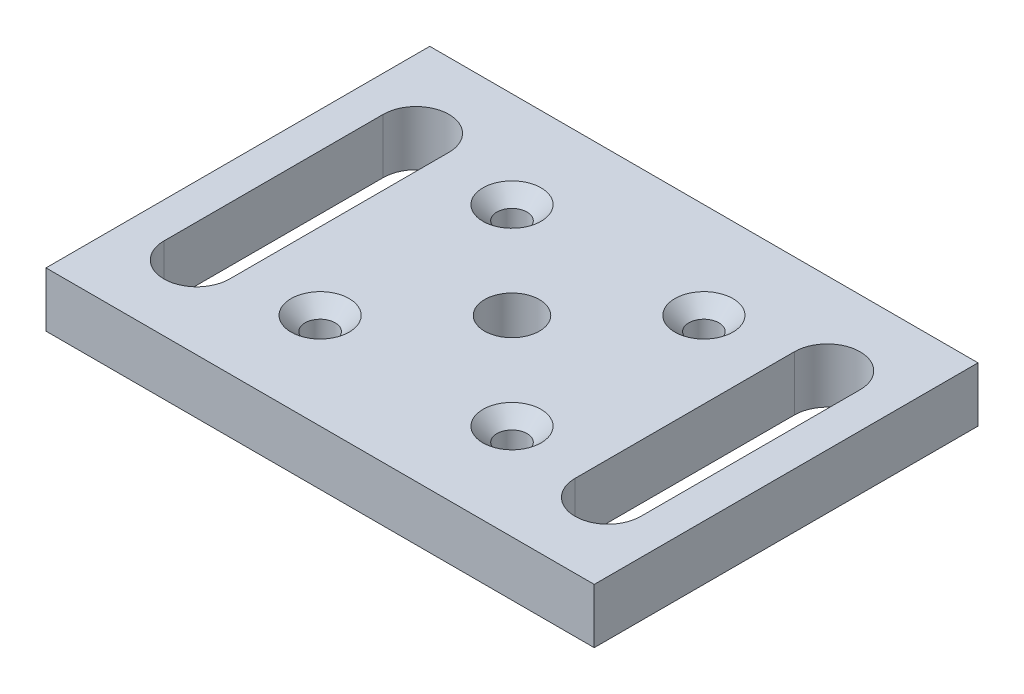
ISO-10303-21;
HEADER;
FILE_DESCRIPTION(('STEP AP214'),'2;1');
FILE_NAME('part.step','',(''),(''),'','','');
FILE_SCHEMA(('AUTOMOTIVE_DESIGN { 1 0 10303 214 1 1 1 1 }'));
ENDSEC;
DATA;
#1=APPLICATION_CONTEXT('core data for automotive mechanical design processes');
#2=APPLICATION_PROTOCOL_DEFINITION('international standard','automotive_design',2000,#1);
#3=PRODUCT_CONTEXT('',#1,'mechanical');
#4=PRODUCT('Part','Part','',(#3));
#5=PRODUCT_RELATED_PRODUCT_CATEGORY('part','',(#4));
#6=PRODUCT_DEFINITION_FORMATION('','',#4);
#7=PRODUCT_DEFINITION_CONTEXT('part definition',#1,'design');
#8=PRODUCT_DEFINITION('design','',#6,#7);
#9=PRODUCT_DEFINITION_SHAPE('','',#8);
#10=(LENGTH_UNIT() NAMED_UNIT(*) SI_UNIT(.MILLI.,.METRE.));
#11=(NAMED_UNIT(*) PLANE_ANGLE_UNIT() SI_UNIT($,.RADIAN.));
#12=(NAMED_UNIT(*) SI_UNIT($,.STERADIAN.) SOLID_ANGLE_UNIT());
#13=UNCERTAINTY_MEASURE_WITH_UNIT(LENGTH_MEASURE(1.E-05),#10,'distance_accuracy_value','');
#14=(GEOMETRIC_REPRESENTATION_CONTEXT(3) GLOBAL_UNCERTAINTY_ASSIGNED_CONTEXT((#13)) GLOBAL_UNIT_ASSIGNED_CONTEXT((#10,
#11,#12)) REPRESENTATION_CONTEXT('',''));
#15=CARTESIAN_POINT('',(0.,0.,0.));
#16=DIRECTION('',(0.,0.,1.));
#17=DIRECTION('',(1.,0.,0.));
#18=AXIS2_PLACEMENT_3D('',#15,#16,#17);
#19=CARTESIAN_POINT('',(0.,0.,0.));
#20=DIRECTION('',(0.,-1.,0.));
#21=DIRECTION('',(0.,0.,-1.));
#22=AXIS2_PLACEMENT_3D('',#19,#20,#21);
#23=PLANE('',#22);
#24=CARTESIAN_POINT('',(32.5,0.,-52.5));
#25=DIRECTION('',(0.,1.,0.));
#26=DIRECTION('',(0.,0.,1.));
#27=AXIS2_PLACEMENT_3D('',#24,#25,#26);
#28=CIRCLE('',#27,2.75);
#29=CARTESIAN_POINT('',(32.5,0.,-49.75));
#30=VERTEX_POINT('',#29);
#31=EDGE_CURVE('E339',#30,#30,#28,.T.);
#32=ORIENTED_EDGE('',*,*,#31,.T.);
#33=EDGE_LOOP('',(#32));
#34=FACE_BOUND('',#33,.T.);
#35=CARTESIAN_POINT('',(67.5,0.,-52.5));
#36=DIRECTION('',(0.,1.,0.));
#37=DIRECTION('',(0.,0.,1.));
#38=AXIS2_PLACEMENT_3D('',#35,#36,#37);
#39=CIRCLE('',#38,2.75);
#40=CARTESIAN_POINT('',(67.5,0.,-49.75));
#41=VERTEX_POINT('',#40);
#42=EDGE_CURVE('E349',#41,#41,#39,.T.);
#43=ORIENTED_EDGE('',*,*,#42,.T.);
#44=EDGE_LOOP('',(#43));
#45=FACE_BOUND('',#44,.T.);
#46=CARTESIAN_POINT('',(67.5,0.,-17.5));
#47=DIRECTION('',(0.,1.,0.));
#48=DIRECTION('',(0.,0.,1.));
#49=AXIS2_PLACEMENT_3D('',#46,#47,#48);
#50=CIRCLE('',#49,2.75);
#51=CARTESIAN_POINT('',(67.5,0.,-14.75));
#52=VERTEX_POINT('',#51);
#53=EDGE_CURVE('E358',#52,#52,#50,.T.);
#54=ORIENTED_EDGE('',*,*,#53,.T.);
#55=EDGE_LOOP('',(#54));
#56=FACE_BOUND('',#55,.T.);
#57=DIRECTION('',(0.,0.,-1.));
#58=VECTOR('',#57,1.);
#59=CARTESIAN_POINT('',(93.5,0.,-55.));
#60=LINE('',#59,#58);
#61=CARTESIAN_POINT('',(93.5,0.,-15.));
#62=VERTEX_POINT('',#61);
#63=CARTESIAN_POINT('',(93.5,0.,-55.));
#64=VERTEX_POINT('',#63);
#65=EDGE_CURVE('E131',#62,#64,#60,.T.);
#66=ORIENTED_EDGE('',*,*,#65,.T.);
#67=CARTESIAN_POINT('',(87.5,0.,-55.));
#68=DIRECTION('',(0.,1.,0.));
#69=DIRECTION('',(0.,0.,1.));
#70=AXIS2_PLACEMENT_3D('',#67,#68,#69);
#71=CIRCLE('',#70,5.99999999999999);
#72=CARTESIAN_POINT('',(81.5,0.,-55.));
#73=VERTEX_POINT('',#72);
#74=EDGE_CURVE('E56',#64,#73,#71,.T.);
#75=ORIENTED_EDGE('',*,*,#74,.T.);
#76=DIRECTION('',(0.,0.,1.));
#77=VECTOR('',#76,1.);
#78=CARTESIAN_POINT('',(81.5,0.,-55.));
#79=LINE('',#78,#77);
#80=CARTESIAN_POINT('',(81.5,0.,-15.));
#81=VERTEX_POINT('',#80);
#82=EDGE_CURVE('E137',#73,#81,#79,.T.);
#83=ORIENTED_EDGE('',*,*,#82,.T.);
#84=CARTESIAN_POINT('',(87.5,0.,-15.));
#85=DIRECTION('',(0.,1.,0.));
#86=DIRECTION('',(0.,0.,1.));
#87=AXIS2_PLACEMENT_3D('',#84,#85,#86);
#88=CIRCLE('',#87,5.99999999999998);
#89=EDGE_CURVE('E154',#81,#62,#88,.T.);
#90=ORIENTED_EDGE('',*,*,#89,.T.);
#91=EDGE_LOOP('',(#66,#75,#83,#90));
#92=FACE_BOUND('',#91,.T.);
#93=DIRECTION('',(0.,0.,-1.));
#94=VECTOR('',#93,1.);
#95=CARTESIAN_POINT('',(18.5,0.,-55.));
#96=LINE('',#95,#94);
#97=CARTESIAN_POINT('',(18.5,0.,-15.));
#98=VERTEX_POINT('',#97);
#99=CARTESIAN_POINT('',(18.5,0.,-55.));
#100=VERTEX_POINT('',#99);
#101=EDGE_CURVE('E165',#98,#100,#96,.T.);
#102=ORIENTED_EDGE('',*,*,#101,.T.);
#103=CARTESIAN_POINT('',(12.5,0.,-55.));
#104=DIRECTION('',(0.,1.,0.));
#105=DIRECTION('',(0.,0.,1.));
#106=AXIS2_PLACEMENT_3D('',#103,#104,#105);
#107=CIRCLE('',#106,6.);
#108=CARTESIAN_POINT('',(6.50000000000001,0.,-55.));
#109=VERTEX_POINT('',#108);
#110=EDGE_CURVE('E138',#100,#109,#107,.T.);
#111=ORIENTED_EDGE('',*,*,#110,.T.);
#112=DIRECTION('',(0.,0.,1.));
#113=VECTOR('',#112,1.);
#114=CARTESIAN_POINT('',(6.50000000000001,0.,-55.));
#115=LINE('',#114,#113);
#116=CARTESIAN_POINT('',(6.50000000000002,0.,-15.));
#117=VERTEX_POINT('',#116);
#118=EDGE_CURVE('E175',#109,#117,#115,.T.);
#119=ORIENTED_EDGE('',*,*,#118,.T.);
#120=CARTESIAN_POINT('',(12.5,0.,-15.));
#121=DIRECTION('',(0.,1.,0.));
#122=DIRECTION('',(0.,0.,1.));
#123=AXIS2_PLACEMENT_3D('',#120,#121,#122);
#124=CIRCLE('',#123,6.);
#125=EDGE_CURVE('E178',#117,#98,#124,.T.);
#126=ORIENTED_EDGE('',*,*,#125,.T.);
#127=EDGE_LOOP('',(#102,#111,#119,#126));
#128=FACE_BOUND('',#127,.T.);
#129=CARTESIAN_POINT('',(50.,0.,-35.));
#130=DIRECTION('',(0.,1.,0.));
#131=DIRECTION('',(0.,0.,1.));
#132=AXIS2_PLACEMENT_3D('',#129,#130,#131);
#133=CIRCLE('',#132,5.00000000000001);
#134=CARTESIAN_POINT('',(50.,0.,-30.));
#135=VERTEX_POINT('',#134);
#136=EDGE_CURVE('E192',#135,#135,#133,.T.);
#137=ORIENTED_EDGE('',*,*,#136,.T.);
#138=EDGE_LOOP('',(#137));
#139=FACE_BOUND('',#138,.T.);
#140=DIRECTION('',(0.,0.,1.));
#141=VECTOR('',#140,1.);
#142=CARTESIAN_POINT('',(0.,0.,0.));
#143=LINE('',#142,#141);
#144=CARTESIAN_POINT('',(0.,0.,-70.));
#145=VERTEX_POINT('',#144);
#146=CARTESIAN_POINT('',(0.,0.,0.));
#147=VERTEX_POINT('',#146);
#148=EDGE_CURVE('E196',#145,#147,#143,.T.);
#149=ORIENTED_EDGE('',*,*,#148,.F.);
#150=DIRECTION('',(-1.,0.,0.));
#151=VECTOR('',#150,1.);
#152=CARTESIAN_POINT('',(0.,0.,-70.));
#153=LINE('',#152,#151);
#154=CARTESIAN_POINT('',(100.,0.,-70.));
#155=VERTEX_POINT('',#154);
#156=EDGE_CURVE('E203',#155,#145,#153,.T.);
#157=ORIENTED_EDGE('',*,*,#156,.F.);
#158=DIRECTION('',(0.,0.,-1.));
#159=VECTOR('',#158,1.);
#160=CARTESIAN_POINT('',(100.,0.,0.));
#161=LINE('',#160,#159);
#162=CARTESIAN_POINT('',(100.,0.,0.));
#163=VERTEX_POINT('',#162);
#164=EDGE_CURVE('E214',#163,#155,#161,.T.);
#165=ORIENTED_EDGE('',*,*,#164,.F.);
#166=DIRECTION('',(1.,0.,0.));
#167=VECTOR('',#166,1.);
#168=CARTESIAN_POINT('',(0.,0.,0.));
#169=LINE('',#168,#167);
#170=EDGE_CURVE('E212',#147,#163,#169,.T.);
#171=ORIENTED_EDGE('',*,*,#170,.F.);
#172=EDGE_LOOP('',(#149,#157,#165,#171));
#173=FACE_BOUND('',#172,.T.);
#174=CARTESIAN_POINT('',(32.5,0.,-17.5));
#175=DIRECTION('',(0.,1.,0.));
#176=DIRECTION('',(0.,0.,1.));
#177=AXIS2_PLACEMENT_3D('',#174,#175,#176);
#178=CIRCLE('',#177,2.75);
#179=CARTESIAN_POINT('',(32.5,0.,-14.75));
#180=VERTEX_POINT('',#179);
#181=EDGE_CURVE('E152',#180,#180,#178,.T.);
#182=ORIENTED_EDGE('',*,*,#181,.T.);
#183=EDGE_LOOP('',(#182));
#184=FACE_BOUND('',#183,.T.);
#185=ADVANCED_FACE('F33',(#34,#45,#56,#92,#128,#139,#173,#184),#23,.T.);
#186=CARTESIAN_POINT('',(0.,10.,0.));
#187=DIRECTION('',(0.,-1.,0.));
#188=DIRECTION('',(0.,0.,-1.));
#189=AXIS2_PLACEMENT_3D('',#186,#187,#188);
#190=PLANE('',#189);
#191=CARTESIAN_POINT('',(32.5,10.,-52.5));
#192=DIRECTION('',(0.,1.,0.));
#193=DIRECTION('',(0.,0.,1.));
#194=AXIS2_PLACEMENT_3D('',#191,#192,#193);
#195=CIRCLE('',#194,5.3);
#196=CARTESIAN_POINT('',(32.5,10.,-47.2));
#197=VERTEX_POINT('',#196);
#198=EDGE_CURVE('E337',#197,#197,#195,.T.);
#199=ORIENTED_EDGE('',*,*,#198,.F.);
#200=EDGE_LOOP('',(#199));
#201=FACE_BOUND('',#200,.T.);
#202=CARTESIAN_POINT('',(67.5,10.,-52.5));
#203=DIRECTION('',(0.,1.,0.));
#204=DIRECTION('',(0.,0.,1.));
#205=AXIS2_PLACEMENT_3D('',#202,#203,#204);
#206=CIRCLE('',#205,5.3);
#207=CARTESIAN_POINT('',(67.5,10.,-47.2));
#208=VERTEX_POINT('',#207);
#209=EDGE_CURVE('E343',#208,#208,#206,.T.);
#210=ORIENTED_EDGE('',*,*,#209,.F.);
#211=EDGE_LOOP('',(#210));
#212=FACE_BOUND('',#211,.T.);
#213=CARTESIAN_POINT('',(67.5,10.,-17.5));
#214=DIRECTION('',(0.,1.,0.));
#215=DIRECTION('',(0.,0.,1.));
#216=AXIS2_PLACEMENT_3D('',#213,#214,#215);
#217=CIRCLE('',#216,5.3);
#218=CARTESIAN_POINT('',(67.5,10.,-12.2));
#219=VERTEX_POINT('',#218);
#220=EDGE_CURVE('E352',#219,#219,#217,.T.);
#221=ORIENTED_EDGE('',*,*,#220,.F.);
#222=EDGE_LOOP('',(#221));
#223=FACE_BOUND('',#222,.T.);
#224=CARTESIAN_POINT('',(12.5,10.,-55.));
#225=DIRECTION('',(0.,1.,0.));
#226=DIRECTION('',(0.,0.,1.));
#227=AXIS2_PLACEMENT_3D('',#224,#225,#226);
#228=CIRCLE('',#227,6.);
#229=CARTESIAN_POINT('',(18.5,10.,-55.));
#230=VERTEX_POINT('',#229);
#231=CARTESIAN_POINT('',(6.50000000000001,10.,-55.));
#232=VERTEX_POINT('',#231);
#233=EDGE_CURVE('E162',#230,#232,#228,.T.);
#234=ORIENTED_EDGE('',*,*,#233,.F.);
#235=DIRECTION('',(0.,0.,-1.));
#236=VECTOR('',#235,1.);
#237=CARTESIAN_POINT('',(18.5,10.,-55.));
#238=LINE('',#237,#236);
#239=CARTESIAN_POINT('',(18.5,10.,-15.));
#240=VERTEX_POINT('',#239);
#241=EDGE_CURVE('E170',#240,#230,#238,.T.);
#242=ORIENTED_EDGE('',*,*,#241,.F.);
#243=CARTESIAN_POINT('',(12.5,10.,-15.));
#244=DIRECTION('',(0.,1.,0.));
#245=DIRECTION('',(0.,0.,1.));
#246=AXIS2_PLACEMENT_3D('',#243,#244,#245);
#247=CIRCLE('',#246,6.);
#248=CARTESIAN_POINT('',(6.50000000000002,10.,-15.));
#249=VERTEX_POINT('',#248);
#250=EDGE_CURVE('E167',#249,#240,#247,.T.);
#251=ORIENTED_EDGE('',*,*,#250,.F.);
#252=DIRECTION('',(0.,0.,1.));
#253=VECTOR('',#252,1.);
#254=CARTESIAN_POINT('',(6.50000000000001,10.,-55.));
#255=LINE('',#254,#253);
#256=EDGE_CURVE('E164',#232,#249,#255,.T.);
#257=ORIENTED_EDGE('',*,*,#256,.F.);
#258=EDGE_LOOP('',(#234,#242,#251,#257));
#259=FACE_BOUND('',#258,.T.);
#260=DIRECTION('',(0.,0.,1.));
#261=VECTOR('',#260,1.);
#262=CARTESIAN_POINT('',(0.,10.,0.));
#263=LINE('',#262,#261);
#264=CARTESIAN_POINT('',(0.,10.,-70.));
#265=VERTEX_POINT('',#264);
#266=CARTESIAN_POINT('',(0.,10.,0.));
#267=VERTEX_POINT('',#266);
#268=EDGE_CURVE('E199',#265,#267,#263,.T.);
#269=ORIENTED_EDGE('',*,*,#268,.T.);
#270=DIRECTION('',(1.,0.,0.));
#271=VECTOR('',#270,1.);
#272=CARTESIAN_POINT('',(0.,10.,0.));
#273=LINE('',#272,#271);
#274=CARTESIAN_POINT('',(100.,10.,0.));
#275=VERTEX_POINT('',#274);
#276=EDGE_CURVE('E202',#267,#275,#273,.T.);
#277=ORIENTED_EDGE('',*,*,#276,.T.);
#278=DIRECTION('',(0.,0.,-1.));
#279=VECTOR('',#278,1.);
#280=CARTESIAN_POINT('',(100.,10.,0.));
#281=LINE('',#280,#279);
#282=CARTESIAN_POINT('',(100.,10.,-70.));
#283=VERTEX_POINT('',#282);
#284=EDGE_CURVE('E205',#275,#283,#281,.T.);
#285=ORIENTED_EDGE('',*,*,#284,.T.);
#286=DIRECTION('',(-1.,0.,0.));
#287=VECTOR('',#286,1.);
#288=CARTESIAN_POINT('',(0.,10.,-70.));
#289=LINE('',#288,#287);
#290=EDGE_CURVE('E207',#283,#265,#289,.T.);
#291=ORIENTED_EDGE('',*,*,#290,.T.);
#292=EDGE_LOOP('',(#269,#277,#285,#291));
#293=FACE_BOUND('',#292,.T.);
#294=CARTESIAN_POINT('',(50.,10.,-35.));
#295=DIRECTION('',(0.,1.,0.));
#296=DIRECTION('',(0.,0.,1.));
#297=AXIS2_PLACEMENT_3D('',#294,#295,#296);
#298=CIRCLE('',#297,5.00000000000001);
#299=CARTESIAN_POINT('',(50.,10.,-30.));
#300=VERTEX_POINT('',#299);
#301=EDGE_CURVE('E193',#300,#300,#298,.T.);
#302=ORIENTED_EDGE('',*,*,#301,.F.);
#303=EDGE_LOOP('',(#302));
#304=FACE_BOUND('',#303,.T.);
#305=CARTESIAN_POINT('',(87.5,10.,-55.));
#306=DIRECTION('',(0.,1.,0.));
#307=DIRECTION('',(0.,0.,1.));
#308=AXIS2_PLACEMENT_3D('',#305,#306,#307);
#309=CIRCLE('',#308,5.99999999999999);
#310=CARTESIAN_POINT('',(93.5,10.,-55.));
#311=VERTEX_POINT('',#310);
#312=CARTESIAN_POINT('',(81.5,10.,-55.));
#313=VERTEX_POINT('',#312);
#314=EDGE_CURVE('E122',#311,#313,#309,.T.);
#315=ORIENTED_EDGE('',*,*,#314,.F.);
#316=DIRECTION('',(0.,0.,-1.));
#317=VECTOR('',#316,1.);
#318=CARTESIAN_POINT('',(93.5,10.,-55.));
#319=LINE('',#318,#317);
#320=CARTESIAN_POINT('',(93.5,10.,-15.));
#321=VERTEX_POINT('',#320);
#322=EDGE_CURVE('E146',#321,#311,#319,.T.);
#323=ORIENTED_EDGE('',*,*,#322,.F.);
#324=CARTESIAN_POINT('',(87.5,10.,-15.));
#325=DIRECTION('',(0.,1.,0.));
#326=DIRECTION('',(0.,0.,1.));
#327=AXIS2_PLACEMENT_3D('',#324,#325,#326);
#328=CIRCLE('',#327,5.99999999999998);
#329=CARTESIAN_POINT('',(81.5,10.,-15.));
#330=VERTEX_POINT('',#329);
#331=EDGE_CURVE('E144',#330,#321,#328,.T.);
#332=ORIENTED_EDGE('',*,*,#331,.F.);
#333=DIRECTION('',(0.,0.,1.));
#334=VECTOR('',#333,1.);
#335=CARTESIAN_POINT('',(81.5,10.,-55.));
#336=LINE('',#335,#334);
#337=EDGE_CURVE('E130',#313,#330,#336,.T.);
#338=ORIENTED_EDGE('',*,*,#337,.F.);
#339=EDGE_LOOP('',(#315,#323,#332,#338));
#340=FACE_BOUND('',#339,.T.);
#341=CARTESIAN_POINT('',(32.5,10.,-17.5));
#342=DIRECTION('',(0.,1.,0.));
#343=DIRECTION('',(0.,0.,1.));
#344=AXIS2_PLACEMENT_3D('',#341,#342,#343);
#345=CIRCLE('',#344,5.3);
#346=CARTESIAN_POINT('',(32.5,10.,-12.2));
#347=VERTEX_POINT('',#346);
#348=EDGE_CURVE('E361',#347,#347,#345,.T.);
#349=ORIENTED_EDGE('',*,*,#348,.F.);
#350=EDGE_LOOP('',(#349));
#351=FACE_BOUND('',#350,.T.);
#352=ADVANCED_FACE('F142',(#201,#212,#223,#259,#293,#304,#340,#351),#190,.F.);
#353=CARTESIAN_POINT('',(0.,10.,0.));
#354=DIRECTION('',(1.,0.,0.));
#355=DIRECTION('',(0.,0.,-1.));
#356=AXIS2_PLACEMENT_3D('',#353,#354,#355);
#357=PLANE('',#356);
#358=ORIENTED_EDGE('',*,*,#148,.T.);
#359=DIRECTION('',(0.,-1.,0.));
#360=VECTOR('',#359,1.);
#361=CARTESIAN_POINT('',(0.,10.,0.));
#362=LINE('',#361,#360);
#363=EDGE_CURVE('E11',#267,#147,#362,.T.);
#364=ORIENTED_EDGE('',*,*,#363,.F.);
#365=ORIENTED_EDGE('',*,*,#268,.F.);
#366=DIRECTION('',(0.,-1.,0.));
#367=VECTOR('',#366,1.);
#368=CARTESIAN_POINT('',(0.,10.,-70.));
#369=LINE('',#368,#367);
#370=EDGE_CURVE('E209',#265,#145,#369,.T.);
#371=ORIENTED_EDGE('',*,*,#370,.T.);
#372=EDGE_LOOP('',(#358,#364,#365,#371));
#373=FACE_BOUND('',#372,.T.);
#374=ADVANCED_FACE('F35',(#373),#357,.F.);
#375=CARTESIAN_POINT('',(0.,10.,0.));
#376=DIRECTION('',(0.,0.,-1.));
#377=DIRECTION('',(-1.,0.,0.));
#378=AXIS2_PLACEMENT_3D('',#375,#376,#377);
#379=PLANE('',#378);
#380=ORIENTED_EDGE('',*,*,#170,.T.);
#381=DIRECTION('',(0.,-1.,0.));
#382=VECTOR('',#381,1.);
#383=CARTESIAN_POINT('',(100.,10.,0.));
#384=LINE('',#383,#382);
#385=EDGE_CURVE('E41',#275,#163,#384,.T.);
#386=ORIENTED_EDGE('',*,*,#385,.F.);
#387=ORIENTED_EDGE('',*,*,#276,.F.);
#388=ORIENTED_EDGE('',*,*,#363,.T.);
#389=EDGE_LOOP('',(#380,#386,#387,#388));
#390=FACE_BOUND('',#389,.T.);
#391=ADVANCED_FACE('F242',(#390),#379,.F.);
#392=CARTESIAN_POINT('',(100.,10.,0.));
#393=DIRECTION('',(-1.,0.,0.));
#394=DIRECTION('',(0.,0.,1.));
#395=AXIS2_PLACEMENT_3D('',#392,#393,#394);
#396=PLANE('',#395);
#397=ORIENTED_EDGE('',*,*,#164,.T.);
#398=DIRECTION('',(0.,-1.,0.));
#399=VECTOR('',#398,1.);
#400=CARTESIAN_POINT('',(100.,10.,-70.));
#401=LINE('',#400,#399);
#402=EDGE_CURVE('E219',#283,#155,#401,.T.);
#403=ORIENTED_EDGE('',*,*,#402,.F.);
#404=ORIENTED_EDGE('',*,*,#284,.F.);
#405=ORIENTED_EDGE('',*,*,#385,.T.);
#406=EDGE_LOOP('',(#397,#403,#404,#405));
#407=FACE_BOUND('',#406,.T.);
#408=ADVANCED_FACE('F226',(#407),#396,.F.);
#409=CARTESIAN_POINT('',(0.,10.,-70.));
#410=DIRECTION('',(0.,0.,1.));
#411=DIRECTION('',(1.,0.,0.));
#412=AXIS2_PLACEMENT_3D('',#409,#410,#411);
#413=PLANE('',#412);
#414=ORIENTED_EDGE('',*,*,#156,.T.);
#415=ORIENTED_EDGE('',*,*,#370,.F.);
#416=ORIENTED_EDGE('',*,*,#290,.F.);
#417=ORIENTED_EDGE('',*,*,#402,.T.);
#418=EDGE_LOOP('',(#414,#415,#416,#417));
#419=FACE_BOUND('',#418,.T.);
#420=ADVANCED_FACE('F235',(#419),#413,.F.);
#421=CARTESIAN_POINT('',(50.,10.,-35.));
#422=DIRECTION('',(0.,-1.,0.));
#423=DIRECTION('',(0.,0.,-1.));
#424=AXIS2_PLACEMENT_3D('',#421,#422,#423);
#425=CYLINDRICAL_SURFACE('',#424,5.00000000000001);
#426=ORIENTED_EDGE('',*,*,#301,.T.);
#427=EDGE_LOOP('',(#426));
#428=FACE_BOUND('',#427,.T.);
#429=ORIENTED_EDGE('',*,*,#136,.F.);
#430=EDGE_LOOP('',(#429));
#431=FACE_BOUND('',#430,.T.);
#432=ADVANCED_FACE('F262',(#428,#431),#425,.F.);
#433=CARTESIAN_POINT('',(12.5,10.,-55.));
#434=DIRECTION('',(0.,-1.,0.));
#435=DIRECTION('',(0.,0.,-1.));
#436=AXIS2_PLACEMENT_3D('',#433,#434,#435);
#437=CYLINDRICAL_SURFACE('',#436,6.);
#438=ORIENTED_EDGE('',*,*,#110,.F.);
#439=DIRECTION('',(0.,-1.,0.));
#440=VECTOR('',#439,1.);
#441=CARTESIAN_POINT('',(18.5,10.,-55.));
#442=LINE('',#441,#440);
#443=EDGE_CURVE('E172',#230,#100,#442,.T.);
#444=ORIENTED_EDGE('',*,*,#443,.F.);
#445=ORIENTED_EDGE('',*,*,#233,.T.);
#446=DIRECTION('',(0.,-1.,0.));
#447=VECTOR('',#446,1.);
#448=CARTESIAN_POINT('',(6.50000000000001,10.,-55.));
#449=LINE('',#448,#447);
#450=EDGE_CURVE('E189',#232,#109,#449,.T.);
#451=ORIENTED_EDGE('',*,*,#450,.T.);
#452=EDGE_LOOP('',(#438,#444,#445,#451));
#453=FACE_BOUND('',#452,.T.);
#454=ADVANCED_FACE('F266',(#453),#437,.F.);
#455=CARTESIAN_POINT('',(6.50000000000001,10.,-55.));
#456=DIRECTION('',(1.,0.,0.));
#457=DIRECTION('',(0.,0.,-1.));
#458=AXIS2_PLACEMENT_3D('',#455,#456,#457);
#459=PLANE('',#458);
#460=ORIENTED_EDGE('',*,*,#118,.F.);
#461=ORIENTED_EDGE('',*,*,#450,.F.);
#462=ORIENTED_EDGE('',*,*,#256,.T.);
#463=DIRECTION('',(0.,-1.,0.));
#464=VECTOR('',#463,1.);
#465=CARTESIAN_POINT('',(6.50000000000002,10.,-15.));
#466=LINE('',#465,#464);
#467=EDGE_CURVE('E187',#249,#117,#466,.T.);
#468=ORIENTED_EDGE('',*,*,#467,.T.);
#469=EDGE_LOOP('',(#460,#461,#462,#468));
#470=FACE_BOUND('',#469,.T.);
#471=ADVANCED_FACE('F271',(#470),#459,.T.);
#472=CARTESIAN_POINT('',(12.5,10.,-15.));
#473=DIRECTION('',(0.,-1.,0.));
#474=DIRECTION('',(0.,0.,-1.));
#475=AXIS2_PLACEMENT_3D('',#472,#473,#474);
#476=CYLINDRICAL_SURFACE('',#475,6.);
#477=ORIENTED_EDGE('',*,*,#125,.F.);
#478=ORIENTED_EDGE('',*,*,#467,.F.);
#479=ORIENTED_EDGE('',*,*,#250,.T.);
#480=DIRECTION('',(0.,-1.,0.));
#481=VECTOR('',#480,1.);
#482=CARTESIAN_POINT('',(18.5,10.,-15.));
#483=LINE('',#482,#481);
#484=EDGE_CURVE('E185',#240,#98,#483,.T.);
#485=ORIENTED_EDGE('',*,*,#484,.T.);
#486=EDGE_LOOP('',(#477,#478,#479,#485));
#487=FACE_BOUND('',#486,.T.);
#488=ADVANCED_FACE('F278',(#487),#476,.F.);
#489=CARTESIAN_POINT('',(18.5,10.,-55.));
#490=DIRECTION('',(-1.,0.,0.));
#491=DIRECTION('',(0.,0.,1.));
#492=AXIS2_PLACEMENT_3D('',#489,#490,#491);
#493=PLANE('',#492);
#494=ORIENTED_EDGE('',*,*,#101,.F.);
#495=ORIENTED_EDGE('',*,*,#484,.F.);
#496=ORIENTED_EDGE('',*,*,#241,.T.);
#497=ORIENTED_EDGE('',*,*,#443,.T.);
#498=EDGE_LOOP('',(#494,#495,#496,#497));
#499=FACE_BOUND('',#498,.T.);
#500=ADVANCED_FACE('F282',(#499),#493,.T.);
#501=CARTESIAN_POINT('',(87.5,10.,-55.));
#502=DIRECTION('',(0.,-1.,0.));
#503=DIRECTION('',(0.,0.,-1.));
#504=AXIS2_PLACEMENT_3D('',#501,#502,#503);
#505=CYLINDRICAL_SURFACE('',#504,5.99999999999999);
#506=ORIENTED_EDGE('',*,*,#74,.F.);
#507=DIRECTION('',(0.,-1.,0.));
#508=VECTOR('',#507,1.);
#509=CARTESIAN_POINT('',(93.5,10.,-55.));
#510=LINE('',#509,#508);
#511=EDGE_CURVE('E126',#311,#64,#510,.T.);
#512=ORIENTED_EDGE('',*,*,#511,.F.);
#513=ORIENTED_EDGE('',*,*,#314,.T.);
#514=DIRECTION('',(0.,-1.,0.));
#515=VECTOR('',#514,1.);
#516=CARTESIAN_POINT('',(81.5,10.,-55.));
#517=LINE('',#516,#515);
#518=EDGE_CURVE('E125',#313,#73,#517,.T.);
#519=ORIENTED_EDGE('',*,*,#518,.T.);
#520=EDGE_LOOP('',(#506,#512,#513,#519));
#521=FACE_BOUND('',#520,.T.);
#522=ADVANCED_FACE('F124',(#521),#505,.F.);
#523=CARTESIAN_POINT('',(81.5,10.,-55.));
#524=DIRECTION('',(1.,0.,0.));
#525=DIRECTION('',(0.,0.,-1.));
#526=AXIS2_PLACEMENT_3D('',#523,#524,#525);
#527=PLANE('',#526);
#528=ORIENTED_EDGE('',*,*,#82,.F.);
#529=ORIENTED_EDGE('',*,*,#518,.F.);
#530=ORIENTED_EDGE('',*,*,#337,.T.);
#531=DIRECTION('',(0.,-1.,0.));
#532=VECTOR('',#531,1.);
#533=CARTESIAN_POINT('',(81.5,10.,-15.));
#534=LINE('',#533,#532);
#535=EDGE_CURVE('E139',#330,#81,#534,.T.);
#536=ORIENTED_EDGE('',*,*,#535,.T.);
#537=EDGE_LOOP('',(#528,#529,#530,#536));
#538=FACE_BOUND('',#537,.T.);
#539=ADVANCED_FACE('F134',(#538),#527,.T.);
#540=CARTESIAN_POINT('',(87.5,10.,-15.));
#541=DIRECTION('',(0.,-1.,0.));
#542=DIRECTION('',(0.,0.,-1.));
#543=AXIS2_PLACEMENT_3D('',#540,#541,#542);
#544=CYLINDRICAL_SURFACE('',#543,5.99999999999998);
#545=ORIENTED_EDGE('',*,*,#89,.F.);
#546=ORIENTED_EDGE('',*,*,#535,.F.);
#547=ORIENTED_EDGE('',*,*,#331,.T.);
#548=DIRECTION('',(0.,-1.,0.));
#549=VECTOR('',#548,1.);
#550=CARTESIAN_POINT('',(93.5,10.,-15.));
#551=LINE('',#550,#549);
#552=EDGE_CURVE('E48',#321,#62,#551,.T.);
#553=ORIENTED_EDGE('',*,*,#552,.T.);
#554=EDGE_LOOP('',(#545,#546,#547,#553));
#555=FACE_BOUND('',#554,.T.);
#556=ADVANCED_FACE('F291',(#555),#544,.F.);
#557=CARTESIAN_POINT('',(93.5,10.,-55.));
#558=DIRECTION('',(-1.,0.,0.));
#559=DIRECTION('',(0.,0.,1.));
#560=AXIS2_PLACEMENT_3D('',#557,#558,#559);
#561=PLANE('',#560);
#562=ORIENTED_EDGE('',*,*,#65,.F.);
#563=ORIENTED_EDGE('',*,*,#552,.F.);
#564=ORIENTED_EDGE('',*,*,#322,.T.);
#565=ORIENTED_EDGE('',*,*,#511,.T.);
#566=EDGE_LOOP('',(#562,#563,#564,#565));
#567=FACE_BOUND('',#566,.T.);
#568=ADVANCED_FACE('F294',(#567),#561,.T.);
#569=CARTESIAN_POINT('',(32.5,10.,-17.5));
#570=DIRECTION('',(0.,1.,0.));
#571=DIRECTION('',(0.,0.,1.));
#572=AXIS2_PLACEMENT_3D('',#569,#570,#571);
#573=CYLINDRICAL_SURFACE('',#572,2.75);
#574=ORIENTED_EDGE('',*,*,#181,.F.);
#575=EDGE_LOOP('',(#574));
#576=FACE_BOUND('',#575,.T.);
#577=CARTESIAN_POINT('',(32.5,7.45,-17.5));
#578=DIRECTION('',(0.,1.,0.));
#579=DIRECTION('',(0.,0.,1.));
#580=AXIS2_PLACEMENT_3D('',#577,#578,#579);
#581=CIRCLE('',#580,2.75);
#582=CARTESIAN_POINT('',(32.5,7.45,-14.75));
#583=VERTEX_POINT('',#582);
#584=EDGE_CURVE('E364',#583,#583,#581,.T.);
#585=ORIENTED_EDGE('',*,*,#584,.T.);
#586=EDGE_LOOP('',(#585));
#587=FACE_BOUND('',#586,.T.);
#588=ADVANCED_FACE('F298',(#576,#587),#573,.F.);
#589=CARTESIAN_POINT('',(32.5,10.,-17.5));
#590=DIRECTION('',(0.,1.,0.));
#591=DIRECTION('',(0.,0.,1.));
#592=AXIS2_PLACEMENT_3D('',#589,#590,#591);
#593=CONICAL_SURFACE('',#592,5.3,0.785398163397449);
#594=ORIENTED_EDGE('',*,*,#584,.F.);
#595=EDGE_LOOP('',(#594));
#596=FACE_BOUND('',#595,.T.);
#597=ORIENTED_EDGE('',*,*,#348,.T.);
#598=EDGE_LOOP('',(#597));
#599=FACE_BOUND('',#598,.T.);
#600=ADVANCED_FACE('F301',(#596,#599),#593,.F.);
#601=CARTESIAN_POINT('',(67.5,10.,-17.5));
#602=DIRECTION('',(0.,1.,0.));
#603=DIRECTION('',(0.,0.,1.));
#604=AXIS2_PLACEMENT_3D('',#601,#602,#603);
#605=CYLINDRICAL_SURFACE('',#604,2.75);
#606=ORIENTED_EDGE('',*,*,#53,.F.);
#607=EDGE_LOOP('',(#606));
#608=FACE_BOUND('',#607,.T.);
#609=CARTESIAN_POINT('',(67.5,7.45,-17.5));
#610=DIRECTION('',(0.,1.,0.));
#611=DIRECTION('',(0.,0.,1.));
#612=AXIS2_PLACEMENT_3D('',#609,#610,#611);
#613=CIRCLE('',#612,2.75);
#614=CARTESIAN_POINT('',(67.5,7.45,-14.75));
#615=VERTEX_POINT('',#614);
#616=EDGE_CURVE('E355',#615,#615,#613,.T.);
#617=ORIENTED_EDGE('',*,*,#616,.T.);
#618=EDGE_LOOP('',(#617));
#619=FACE_BOUND('',#618,.T.);
#620=ADVANCED_FACE('F305',(#608,#619),#605,.F.);
#621=CARTESIAN_POINT('',(67.5,10.,-17.5));
#622=DIRECTION('',(0.,1.,0.));
#623=DIRECTION('',(0.,0.,1.));
#624=AXIS2_PLACEMENT_3D('',#621,#622,#623);
#625=CONICAL_SURFACE('',#624,5.3,0.785398163397448);
#626=ORIENTED_EDGE('',*,*,#616,.F.);
#627=EDGE_LOOP('',(#626));
#628=FACE_BOUND('',#627,.T.);
#629=ORIENTED_EDGE('',*,*,#220,.T.);
#630=EDGE_LOOP('',(#629));
#631=FACE_BOUND('',#630,.T.);
#632=ADVANCED_FACE('F309',(#628,#631),#625,.F.);
#633=CARTESIAN_POINT('',(67.5,10.,-52.5));
#634=DIRECTION('',(0.,1.,0.));
#635=DIRECTION('',(0.,0.,1.));
#636=AXIS2_PLACEMENT_3D('',#633,#634,#635);
#637=CYLINDRICAL_SURFACE('',#636,2.75);
#638=ORIENTED_EDGE('',*,*,#42,.F.);
#639=EDGE_LOOP('',(#638));
#640=FACE_BOUND('',#639,.T.);
#641=CARTESIAN_POINT('',(67.5,7.45,-52.5));
#642=DIRECTION('',(0.,1.,0.));
#643=DIRECTION('',(0.,0.,1.));
#644=AXIS2_PLACEMENT_3D('',#641,#642,#643);
#645=CIRCLE('',#644,2.75);
#646=CARTESIAN_POINT('',(67.5,7.45,-49.75));
#647=VERTEX_POINT('',#646);
#648=EDGE_CURVE('E346',#647,#647,#645,.T.);
#649=ORIENTED_EDGE('',*,*,#648,.T.);
#650=EDGE_LOOP('',(#649));
#651=FACE_BOUND('',#650,.T.);
#652=ADVANCED_FACE('F313',(#640,#651),#637,.F.);
#653=CARTESIAN_POINT('',(67.5,10.,-52.5));
#654=DIRECTION('',(0.,1.,0.));
#655=DIRECTION('',(0.,0.,1.));
#656=AXIS2_PLACEMENT_3D('',#653,#654,#655);
#657=CONICAL_SURFACE('',#656,5.3,0.785398163397448);
#658=ORIENTED_EDGE('',*,*,#648,.F.);
#659=EDGE_LOOP('',(#658));
#660=FACE_BOUND('',#659,.T.);
#661=ORIENTED_EDGE('',*,*,#209,.T.);
#662=EDGE_LOOP('',(#661));
#663=FACE_BOUND('',#662,.T.);
#664=ADVANCED_FACE('F317',(#660,#663),#657,.F.);
#665=CARTESIAN_POINT('',(32.5,10.,-52.5));
#666=DIRECTION('',(0.,1.,0.));
#667=DIRECTION('',(0.,0.,1.));
#668=AXIS2_PLACEMENT_3D('',#665,#666,#667);
#669=CYLINDRICAL_SURFACE('',#668,2.75);
#670=ORIENTED_EDGE('',*,*,#31,.F.);
#671=EDGE_LOOP('',(#670));
#672=FACE_BOUND('',#671,.T.);
#673=CARTESIAN_POINT('',(32.5,7.45,-52.5));
#674=DIRECTION('',(0.,1.,0.));
#675=DIRECTION('',(0.,0.,1.));
#676=AXIS2_PLACEMENT_3D('',#673,#674,#675);
#677=CIRCLE('',#676,2.75);
#678=CARTESIAN_POINT('',(32.5,7.45,-49.75));
#679=VERTEX_POINT('',#678);
#680=EDGE_CURVE('E334',#679,#679,#677,.T.);
#681=ORIENTED_EDGE('',*,*,#680,.T.);
#682=EDGE_LOOP('',(#681));
#683=FACE_BOUND('',#682,.T.);
#684=ADVANCED_FACE('F321',(#672,#683),#669,.F.);
#685=CARTESIAN_POINT('',(32.5,10.,-52.5));
#686=DIRECTION('',(0.,1.,0.));
#687=DIRECTION('',(0.,0.,1.));
#688=AXIS2_PLACEMENT_3D('',#685,#686,#687);
#689=CONICAL_SURFACE('',#688,5.3,0.785398163397449);
#690=ORIENTED_EDGE('',*,*,#680,.F.);
#691=EDGE_LOOP('',(#690));
#692=FACE_BOUND('',#691,.T.);
#693=ORIENTED_EDGE('',*,*,#198,.T.);
#694=EDGE_LOOP('',(#693));
#695=FACE_BOUND('',#694,.T.);
#696=ADVANCED_FACE('F325',(#692,#695),#689,.F.);
#697=CLOSED_SHELL('',(#185,#352,#374,#391,#408,#420,#432,#454,#471,#488,#500,#522,#539,#556,
#568,#588,#600,#620,#632,#652,#664,#684,#696));
#698=MANIFOLD_SOLID_BREP('B2',#697);
#699=ADVANCED_BREP_SHAPE_REPRESENTATION('',(#18,#698),#14);
#700=SHAPE_DEFINITION_REPRESENTATION(#9,#699);
ENDSEC;
END-ISO-10303-21;
